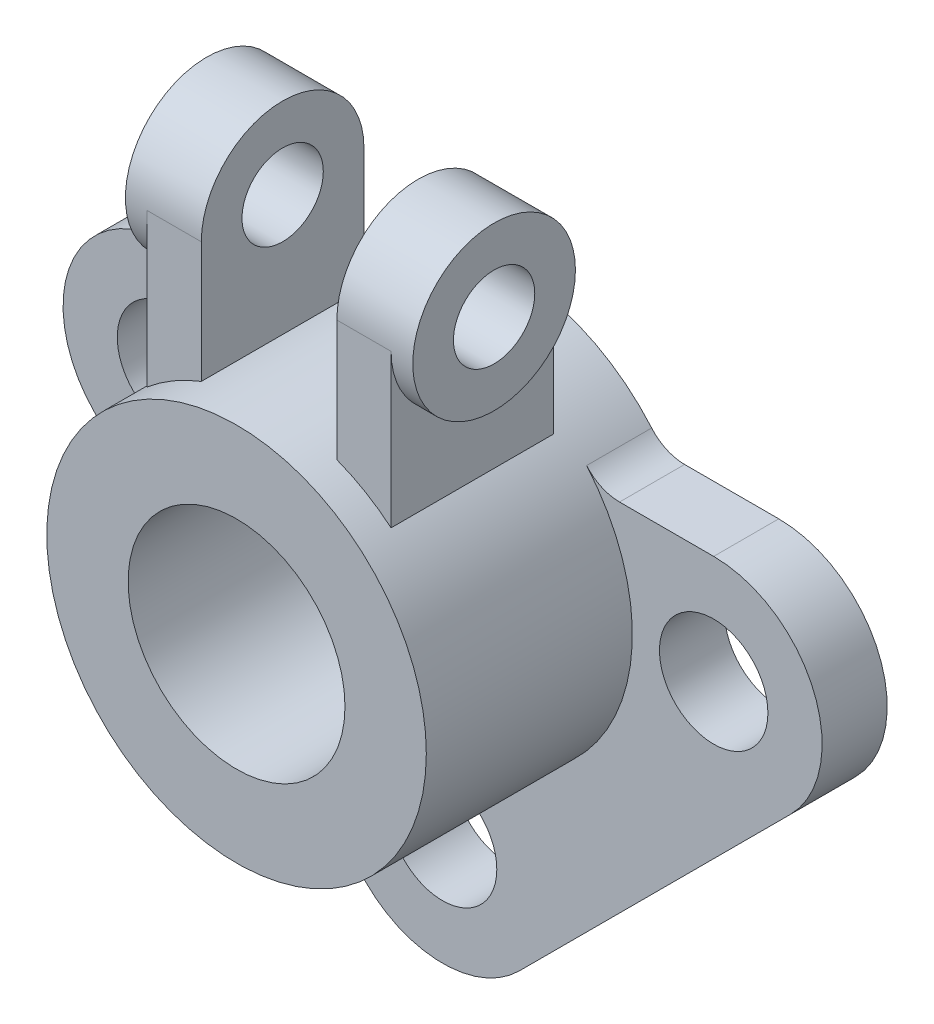
ISO-10303-21;
HEADER;
FILE_DESCRIPTION(('STEP AP214'),'2;1');
FILE_NAME('part.step','',(''),(''),'','','');
FILE_SCHEMA(('AUTOMOTIVE_DESIGN { 1 0 10303 214 1 1 1 1 }'));
ENDSEC;
DATA;
#1=APPLICATION_CONTEXT('core data for automotive mechanical design processes');
#2=APPLICATION_PROTOCOL_DEFINITION('international standard','automotive_design',2000,#1);
#3=PRODUCT_CONTEXT('',#1,'mechanical');
#4=PRODUCT('Part','Part','',(#3));
#5=PRODUCT_RELATED_PRODUCT_CATEGORY('part','',(#4));
#6=PRODUCT_DEFINITION_FORMATION('','',#4);
#7=PRODUCT_DEFINITION_CONTEXT('part definition',#1,'design');
#8=PRODUCT_DEFINITION('design','',#6,#7);
#9=PRODUCT_DEFINITION_SHAPE('','',#8);
#10=(LENGTH_UNIT() NAMED_UNIT(*) SI_UNIT(.MILLI.,.METRE.));
#11=(NAMED_UNIT(*) PLANE_ANGLE_UNIT() SI_UNIT($,.RADIAN.));
#12=(NAMED_UNIT(*) SI_UNIT($,.STERADIAN.) SOLID_ANGLE_UNIT());
#13=UNCERTAINTY_MEASURE_WITH_UNIT(LENGTH_MEASURE(1.E-05),#10,'distance_accuracy_value','');
#14=(GEOMETRIC_REPRESENTATION_CONTEXT(3) GLOBAL_UNCERTAINTY_ASSIGNED_CONTEXT((#13)) GLOBAL_UNIT_ASSIGNED_CONTEXT((#10,
#11,#12)) REPRESENTATION_CONTEXT('',''));
#15=CARTESIAN_POINT('',(0.,0.,0.));
#16=DIRECTION('',(0.,0.,1.));
#17=DIRECTION('',(1.,0.,0.));
#18=AXIS2_PLACEMENT_3D('',#15,#16,#17);
#19=CARTESIAN_POINT('',(0.,0.,50.));
#20=DIRECTION('',(0.,0.,-1.));
#21=DIRECTION('',(-1.,0.,0.));
#22=AXIS2_PLACEMENT_3D('',#19,#20,#21);
#23=CYLINDRICAL_SURFACE('',#22,35.);
#24=CARTESIAN_POINT('',(0.,0.,50.));
#25=DIRECTION('',(0.,0.,1.));
#26=DIRECTION('',(1.,0.,0.));
#27=AXIS2_PLACEMENT_3D('',#24,#25,#26);
#28=CIRCLE('',#27,35.);
#29=CARTESIAN_POINT('',(35.,0.,50.));
#30=VERTEX_POINT('',#29);
#31=EDGE_CURVE('E250',#30,#30,#28,.T.);
#32=ORIENTED_EDGE('',*,*,#31,.F.);
#33=EDGE_LOOP('',(#32));
#34=FACE_BOUND('',#33,.T.);
#35=CARTESIAN_POINT('',(0.,0.,0.));
#36=DIRECTION('',(0.,0.,1.));
#37=DIRECTION('',(1.,0.,0.));
#38=AXIS2_PLACEMENT_3D('',#35,#36,#37);
#39=CIRCLE('',#38,35.);
#40=CARTESIAN_POINT('',(26.5628330475733,22.7906976744186,0.));
#41=VERTEX_POINT('',#40);
#42=CARTESIAN_POINT('',(-26.5628330475733,22.7906976744186,0.));
#43=VERTEX_POINT('',#42);
#44=EDGE_CURVE('E249',#41,#43,#39,.T.);
#45=ORIENTED_EDGE('',*,*,#44,.T.);
#46=DIRECTION('',(0.,0.,-1.));
#47=VECTOR('',#46,1.);
#48=CARTESIAN_POINT('',(-26.5628330475733,22.7906976744186,50.));
#49=LINE('',#48,#47);
#50=CARTESIAN_POINT('',(-26.5628330475733,22.7906976744186,12.));
#51=VERTEX_POINT('',#50);
#52=EDGE_CURVE('E368',#43,#51,#49,.F.);
#53=ORIENTED_EDGE('',*,*,#52,.T.);
#54=CARTESIAN_POINT('',(0.,0.,12.));
#55=DIRECTION('',(0.,0.,1.));
#56=DIRECTION('',(1.,0.,0.));
#57=AXIS2_PLACEMENT_3D('',#54,#55,#56);
#58=CIRCLE('',#57,35.);
#59=CARTESIAN_POINT('',(26.5628330475733,22.7906976744186,12.));
#60=VERTEX_POINT('',#59);
#61=EDGE_CURVE('E266',#51,#60,#58,.T.);
#62=ORIENTED_EDGE('',*,*,#61,.T.);
#63=DIRECTION('',(0.,0.,-1.));
#64=VECTOR('',#63,1.);
#65=CARTESIAN_POINT('',(26.5628330475733,22.7906976744186,50.));
#66=LINE('',#65,#64);
#67=EDGE_CURVE('E364',#60,#41,#66,.T.);
#68=ORIENTED_EDGE('',*,*,#67,.T.);
#69=EDGE_LOOP('',(#45,#53,#62,#68));
#70=FACE_BOUND('',#69,.T.);
#71=CARTESIAN_POINT('',(0.,0.,14.));
#72=DIRECTION('',(0.,0.,1.));
#73=DIRECTION('',(1.,0.,0.));
#74=AXIS2_PLACEMENT_3D('',#71,#72,#73);
#75=CIRCLE('',#74,35.);
#76=CARTESIAN_POINT('',(22.5,26.809513236909,14.));
#77=VERTEX_POINT('',#76);
#78=CARTESIAN_POINT('',(12.5,32.6917420765551,14.));
#79=VERTEX_POINT('',#78);
#80=EDGE_CURVE('E392',#77,#79,#75,.T.);
#81=ORIENTED_EDGE('',*,*,#80,.F.);
#82=DIRECTION('',(0.,0.,-1.));
#83=VECTOR('',#82,1.);
#84=CARTESIAN_POINT('',(22.5,26.809513236909,50.));
#85=LINE('',#84,#83);
#86=CARTESIAN_POINT('',(22.5,26.809513236909,44.));
#87=VERTEX_POINT('',#86);
#88=EDGE_CURVE('E11',#77,#87,#85,.F.);
#89=ORIENTED_EDGE('',*,*,#88,.T.);
#90=CARTESIAN_POINT('',(0.,0.,44.));
#91=DIRECTION('',(0.,0.,-1.));
#92=DIRECTION('',(-1.,0.,0.));
#93=AXIS2_PLACEMENT_3D('',#90,#91,#92);
#94=CIRCLE('',#93,35.);
#95=CARTESIAN_POINT('',(12.5,32.6917420765551,44.));
#96=VERTEX_POINT('',#95);
#97=EDGE_CURVE('E47',#96,#87,#94,.T.);
#98=ORIENTED_EDGE('',*,*,#97,.F.);
#99=DIRECTION('',(0.,0.,-1.));
#100=VECTOR('',#99,1.);
#101=CARTESIAN_POINT('',(12.5,32.6917420765551,50.));
#102=LINE('',#101,#100);
#103=EDGE_CURVE('E388',#79,#96,#102,.F.);
#104=ORIENTED_EDGE('',*,*,#103,.F.);
#105=EDGE_LOOP('',(#81,#89,#98,#104));
#106=FACE_BOUND('',#105,.T.);
#107=CARTESIAN_POINT('',(0.,0.,44.));
#108=DIRECTION('',(0.,0.,1.));
#109=DIRECTION('',(1.,0.,0.));
#110=AXIS2_PLACEMENT_3D('',#107,#108,#109);
#111=CIRCLE('',#110,35.);
#112=CARTESIAN_POINT('',(-12.5,32.6917420765551,44.));
#113=VERTEX_POINT('',#112);
#114=CARTESIAN_POINT('',(-22.5,26.809513236909,44.));
#115=VERTEX_POINT('',#114);
#116=EDGE_CURVE('E54',#113,#115,#111,.T.);
#117=ORIENTED_EDGE('',*,*,#116,.T.);
#118=DIRECTION('',(0.,0.,-1.));
#119=VECTOR('',#118,1.);
#120=CARTESIAN_POINT('',(-22.5,26.809513236909,50.));
#121=LINE('',#120,#119);
#122=CARTESIAN_POINT('',(-22.5,26.809513236909,14.));
#123=VERTEX_POINT('',#122);
#124=EDGE_CURVE('E204',#123,#115,#121,.F.);
#125=ORIENTED_EDGE('',*,*,#124,.F.);
#126=CARTESIAN_POINT('',(0.,0.,14.));
#127=DIRECTION('',(0.,0.,-1.));
#128=DIRECTION('',(-1.,0.,0.));
#129=AXIS2_PLACEMENT_3D('',#126,#127,#128);
#130=CIRCLE('',#129,35.);
#131=CARTESIAN_POINT('',(-12.5,32.6917420765551,14.));
#132=VERTEX_POINT('',#131);
#133=EDGE_CURVE('E199',#123,#132,#130,.T.);
#134=ORIENTED_EDGE('',*,*,#133,.T.);
#135=DIRECTION('',(0.,0.,-1.));
#136=VECTOR('',#135,1.);
#137=CARTESIAN_POINT('',(-12.5,32.6917420765551,50.));
#138=LINE('',#137,#136);
#139=EDGE_CURVE('E59',#132,#113,#138,.F.);
#140=ORIENTED_EDGE('',*,*,#139,.T.);
#141=EDGE_LOOP('',(#117,#125,#134,#140));
#142=FACE_BOUND('',#141,.T.);
#143=ADVANCED_FACE('F38',(#34,#70,#106,#142),#23,.T.);
#144=CARTESIAN_POINT('',(0.,20.,12.));
#145=DIRECTION('',(0.,1.,0.));
#146=DIRECTION('',(-1.,0.,0.));
#147=AXIS2_PLACEMENT_3D('',#144,#145,#146);
#148=PLANE('',#147);
#149=DIRECTION('',(1.,0.,0.));
#150=VECTOR('',#149,1.);
#151=CARTESIAN_POINT('',(0.,20.,12.));
#152=LINE('',#151,#150);
#153=CARTESIAN_POINT('',(-50.,20.,12.));
#154=VERTEX_POINT('',#153);
#155=CARTESIAN_POINT('',(-32.6343377441615,20.,12.));
#156=VERTEX_POINT('',#155);
#157=EDGE_CURVE('E269',#154,#156,#152,.T.);
#158=ORIENTED_EDGE('',*,*,#157,.T.);
#159=DIRECTION('',(0.,0.,-1.));
#160=VECTOR('',#159,1.);
#161=CARTESIAN_POINT('',(-32.6343377441615,20.,12.));
#162=LINE('',#161,#160);
#163=CARTESIAN_POINT('',(-32.6343377441615,20.,0.));
#164=VERTEX_POINT('',#163);
#165=EDGE_CURVE('E360',#156,#164,#162,.T.);
#166=ORIENTED_EDGE('',*,*,#165,.T.);
#167=DIRECTION('',(1.,0.,0.));
#168=VECTOR('',#167,1.);
#169=CARTESIAN_POINT('',(0.,20.,0.));
#170=LINE('',#169,#168);
#171=CARTESIAN_POINT('',(-50.,20.,0.));
#172=VERTEX_POINT('',#171);
#173=EDGE_CURVE('E259',#172,#164,#170,.T.);
#174=ORIENTED_EDGE('',*,*,#173,.F.);
#175=DIRECTION('',(0.,0.,-1.));
#176=VECTOR('',#175,1.);
#177=CARTESIAN_POINT('',(-50.,20.,12.));
#178=LINE('',#177,#176);
#179=EDGE_CURVE('E357',#154,#172,#178,.T.);
#180=ORIENTED_EDGE('',*,*,#179,.F.);
#181=EDGE_LOOP('',(#158,#166,#174,#180));
#182=FACE_BOUND('',#181,.T.);
#183=ADVANCED_FACE('F428',(#182),#148,.T.);
#184=CARTESIAN_POINT('',(-50.,0.,12.));
#185=DIRECTION('',(0.,0.,-1.));
#186=DIRECTION('',(-1.,0.,0.));
#187=AXIS2_PLACEMENT_3D('',#184,#185,#186);
#188=CYLINDRICAL_SURFACE('',#187,20.);
#189=CARTESIAN_POINT('',(-50.,0.,0.));
#190=DIRECTION('',(0.,0.,1.));
#191=DIRECTION('',(1.,0.,0.));
#192=AXIS2_PLACEMENT_3D('',#189,#190,#191);
#193=CIRCLE('',#192,20.);
#194=CARTESIAN_POINT('',(-64.142135623731,-14.142135623731,0.));
#195=VERTEX_POINT('',#194);
#196=EDGE_CURVE('E310',#172,#195,#193,.T.);
#197=ORIENTED_EDGE('',*,*,#196,.T.);
#198=DIRECTION('',(0.,0.,-1.));
#199=VECTOR('',#198,1.);
#200=CARTESIAN_POINT('',(-64.142135623731,-14.142135623731,12.));
#201=LINE('',#200,#199);
#202=CARTESIAN_POINT('',(-64.142135623731,-14.142135623731,12.));
#203=VERTEX_POINT('',#202);
#204=EDGE_CURVE('E354',#203,#195,#201,.T.);
#205=ORIENTED_EDGE('',*,*,#204,.F.);
#206=CARTESIAN_POINT('',(-50.,0.,12.));
#207=DIRECTION('',(0.,0.,1.));
#208=DIRECTION('',(1.,0.,0.));
#209=AXIS2_PLACEMENT_3D('',#206,#207,#208);
#210=CIRCLE('',#209,20.);
#211=EDGE_CURVE('E274',#154,#203,#210,.T.);
#212=ORIENTED_EDGE('',*,*,#211,.F.);
#213=ORIENTED_EDGE('',*,*,#179,.T.);
#214=EDGE_LOOP('',(#197,#205,#212,#213));
#215=FACE_BOUND('',#214,.T.);
#216=ADVANCED_FACE('F434',(#215),#188,.T.);
#217=CARTESIAN_POINT('',(-39.142135623731,-39.142135623731,12.));
#218=DIRECTION('',(-0.707106781186547,-0.707106781186548,0.));
#219=DIRECTION('',(0.707106781186548,-0.707106781186547,0.));
#220=AXIS2_PLACEMENT_3D('',#217,#218,#219);
#221=PLANE('',#220);
#222=DIRECTION('',(-0.707106781186548,0.707106781186547,0.));
#223=VECTOR('',#222,1.);
#224=CARTESIAN_POINT('',(-39.142135623731,-39.142135623731,0.));
#225=LINE('',#224,#223);
#226=CARTESIAN_POINT('',(-14.142135623731,-64.142135623731,0.));
#227=VERTEX_POINT('',#226);
#228=EDGE_CURVE('E315',#227,#195,#225,.T.);
#229=ORIENTED_EDGE('',*,*,#228,.F.);
#230=DIRECTION('',(0.,0.,-1.));
#231=VECTOR('',#230,1.);
#232=CARTESIAN_POINT('',(-14.142135623731,-64.142135623731,12.));
#233=LINE('',#232,#231);
#234=CARTESIAN_POINT('',(-14.142135623731,-64.142135623731,12.));
#235=VERTEX_POINT('',#234);
#236=EDGE_CURVE('E351',#235,#227,#233,.T.);
#237=ORIENTED_EDGE('',*,*,#236,.F.);
#238=DIRECTION('',(-0.707106781186548,0.707106781186547,0.));
#239=VECTOR('',#238,1.);
#240=CARTESIAN_POINT('',(-39.142135623731,-39.142135623731,12.));
#241=LINE('',#240,#239);
#242=EDGE_CURVE('E278',#235,#203,#241,.T.);
#243=ORIENTED_EDGE('',*,*,#242,.T.);
#244=ORIENTED_EDGE('',*,*,#204,.T.);
#245=EDGE_LOOP('',(#229,#237,#243,#244));
#246=FACE_BOUND('',#245,.T.);
#247=ADVANCED_FACE('F477',(#246),#221,.T.);
#248=CARTESIAN_POINT('',(0.,-50.,12.));
#249=DIRECTION('',(0.,0.,-1.));
#250=DIRECTION('',(-1.,0.,0.));
#251=AXIS2_PLACEMENT_3D('',#248,#249,#250);
#252=CYLINDRICAL_SURFACE('',#251,20.);
#253=CARTESIAN_POINT('',(0.,-50.,0.));
#254=DIRECTION('',(0.,0.,1.));
#255=DIRECTION('',(1.,0.,0.));
#256=AXIS2_PLACEMENT_3D('',#253,#254,#255);
#257=CIRCLE('',#256,20.);
#258=CARTESIAN_POINT('',(14.142135623731,-64.1421356237309,0.));
#259=VERTEX_POINT('',#258);
#260=EDGE_CURVE('E319',#259,#227,#257,.F.);
#261=ORIENTED_EDGE('',*,*,#260,.F.);
#262=DIRECTION('',(0.,0.,-1.));
#263=VECTOR('',#262,1.);
#264=CARTESIAN_POINT('',(14.142135623731,-64.1421356237309,12.));
#265=LINE('',#264,#263);
#266=CARTESIAN_POINT('',(14.142135623731,-64.1421356237309,12.));
#267=VERTEX_POINT('',#266);
#268=EDGE_CURVE('E348',#267,#259,#265,.T.);
#269=ORIENTED_EDGE('',*,*,#268,.F.);
#270=CARTESIAN_POINT('',(0.,-50.,12.));
#271=DIRECTION('',(0.,0.,1.));
#272=DIRECTION('',(1.,0.,0.));
#273=AXIS2_PLACEMENT_3D('',#270,#271,#272);
#274=CIRCLE('',#273,20.);
#275=EDGE_CURVE('E282',#267,#235,#274,.F.);
#276=ORIENTED_EDGE('',*,*,#275,.T.);
#277=ORIENTED_EDGE('',*,*,#236,.T.);
#278=EDGE_LOOP('',(#261,#269,#276,#277));
#279=FACE_BOUND('',#278,.T.);
#280=ADVANCED_FACE('F473',(#279),#252,.T.);
#281=CARTESIAN_POINT('',(39.1421356237309,-39.1421356237309,12.));
#282=DIRECTION('',(0.707106781186547,-0.707106781186547,0.));
#283=DIRECTION('',(0.707106781186548,0.707106781186548,0.));
#284=AXIS2_PLACEMENT_3D('',#281,#282,#283);
#285=PLANE('',#284);
#286=DIRECTION('',(-0.707106781186548,-0.707106781186548,0.));
#287=VECTOR('',#286,1.);
#288=CARTESIAN_POINT('',(39.1421356237309,-39.1421356237309,0.));
#289=LINE('',#288,#287);
#290=CARTESIAN_POINT('',(64.142135623731,-14.1421356237309,0.));
#291=VERTEX_POINT('',#290);
#292=EDGE_CURVE('E323',#291,#259,#289,.T.);
#293=ORIENTED_EDGE('',*,*,#292,.F.);
#294=DIRECTION('',(0.,0.,-1.));
#295=VECTOR('',#294,1.);
#296=CARTESIAN_POINT('',(64.142135623731,-14.1421356237309,12.));
#297=LINE('',#296,#295);
#298=CARTESIAN_POINT('',(64.142135623731,-14.1421356237309,12.));
#299=VERTEX_POINT('',#298);
#300=EDGE_CURVE('E345',#299,#291,#297,.T.);
#301=ORIENTED_EDGE('',*,*,#300,.F.);
#302=DIRECTION('',(-0.707106781186548,-0.707106781186548,0.));
#303=VECTOR('',#302,1.);
#304=CARTESIAN_POINT('',(39.1421356237309,-39.1421356237309,12.));
#305=LINE('',#304,#303);
#306=EDGE_CURVE('E286',#299,#267,#305,.T.);
#307=ORIENTED_EDGE('',*,*,#306,.T.);
#308=ORIENTED_EDGE('',*,*,#268,.T.);
#309=EDGE_LOOP('',(#293,#301,#307,#308));
#310=FACE_BOUND('',#309,.T.);
#311=ADVANCED_FACE('F469',(#310),#285,.T.);
#312=CARTESIAN_POINT('',(50.,0.,12.));
#313=DIRECTION('',(0.,0.,-1.));
#314=DIRECTION('',(-1.,0.,0.));
#315=AXIS2_PLACEMENT_3D('',#312,#313,#314);
#316=CYLINDRICAL_SURFACE('',#315,20.);
#317=CARTESIAN_POINT('',(50.,0.,0.));
#318=DIRECTION('',(0.,0.,1.));
#319=DIRECTION('',(1.,0.,0.));
#320=AXIS2_PLACEMENT_3D('',#317,#318,#319);
#321=CIRCLE('',#320,20.);
#322=CARTESIAN_POINT('',(50.,20.,0.));
#323=VERTEX_POINT('',#322);
#324=EDGE_CURVE('E327',#323,#291,#321,.F.);
#325=ORIENTED_EDGE('',*,*,#324,.F.);
#326=DIRECTION('',(0.,0.,-1.));
#327=VECTOR('',#326,1.);
#328=CARTESIAN_POINT('',(50.,20.,12.));
#329=LINE('',#328,#327);
#330=CARTESIAN_POINT('',(50.,20.,12.));
#331=VERTEX_POINT('',#330);
#332=EDGE_CURVE('E306',#331,#323,#329,.T.);
#333=ORIENTED_EDGE('',*,*,#332,.F.);
#334=CARTESIAN_POINT('',(50.,0.,12.));
#335=DIRECTION('',(0.,0.,1.));
#336=DIRECTION('',(1.,0.,0.));
#337=AXIS2_PLACEMENT_3D('',#334,#335,#336);
#338=CIRCLE('',#337,20.);
#339=EDGE_CURVE('E290',#331,#299,#338,.F.);
#340=ORIENTED_EDGE('',*,*,#339,.T.);
#341=ORIENTED_EDGE('',*,*,#300,.T.);
#342=EDGE_LOOP('',(#325,#333,#340,#341));
#343=FACE_BOUND('',#342,.T.);
#344=ADVANCED_FACE('F460',(#343),#316,.T.);
#345=CARTESIAN_POINT('',(-50.,0.,12.));
#346=DIRECTION('',(0.,0.,-1.));
#347=DIRECTION('',(-1.,0.,0.));
#348=AXIS2_PLACEMENT_3D('',#345,#346,#347);
#349=CYLINDRICAL_SURFACE('',#348,10.);
#350=CARTESIAN_POINT('',(-50.,0.,12.));
#351=DIRECTION('',(0.,0.,1.));
#352=DIRECTION('',(1.,0.,0.));
#353=AXIS2_PLACEMENT_3D('',#350,#351,#352);
#354=CIRCLE('',#353,10.);
#355=CARTESIAN_POINT('',(-40.,0.,12.));
#356=VERTEX_POINT('',#355);
#357=EDGE_CURVE('E298',#356,#356,#354,.T.);
#358=ORIENTED_EDGE('',*,*,#357,.T.);
#359=EDGE_LOOP('',(#358));
#360=FACE_BOUND('',#359,.T.);
#361=CARTESIAN_POINT('',(-50.,0.,0.));
#362=DIRECTION('',(0.,0.,1.));
#363=DIRECTION('',(1.,0.,0.));
#364=AXIS2_PLACEMENT_3D('',#361,#362,#363);
#365=CIRCLE('',#364,10.);
#366=CARTESIAN_POINT('',(-40.,0.,0.));
#367=VERTEX_POINT('',#366);
#368=EDGE_CURVE('E335',#367,#367,#365,.T.);
#369=ORIENTED_EDGE('',*,*,#368,.F.);
#370=EDGE_LOOP('',(#369));
#371=FACE_BOUND('',#370,.T.);
#372=ADVANCED_FACE('F456',(#360,#371),#349,.F.);
#373=CARTESIAN_POINT('',(50.,0.,12.));
#374=DIRECTION('',(0.,0.,-1.));
#375=DIRECTION('',(-1.,0.,0.));
#376=AXIS2_PLACEMENT_3D('',#373,#374,#375);
#377=CYLINDRICAL_SURFACE('',#376,10.);
#378=CARTESIAN_POINT('',(50.,0.,12.));
#379=DIRECTION('',(0.,0.,1.));
#380=DIRECTION('',(1.,0.,0.));
#381=AXIS2_PLACEMENT_3D('',#378,#379,#380);
#382=CIRCLE('',#381,10.);
#383=CARTESIAN_POINT('',(60.,0.,12.));
#384=VERTEX_POINT('',#383);
#385=EDGE_CURVE('E294',#384,#384,#382,.T.);
#386=ORIENTED_EDGE('',*,*,#385,.T.);
#387=EDGE_LOOP('',(#386));
#388=FACE_BOUND('',#387,.T.);
#389=CARTESIAN_POINT('',(50.,0.,0.));
#390=DIRECTION('',(0.,0.,1.));
#391=DIRECTION('',(1.,0.,0.));
#392=AXIS2_PLACEMENT_3D('',#389,#390,#391);
#393=CIRCLE('',#392,10.);
#394=CARTESIAN_POINT('',(60.,0.,0.));
#395=VERTEX_POINT('',#394);
#396=EDGE_CURVE('E331',#395,#395,#393,.T.);
#397=ORIENTED_EDGE('',*,*,#396,.F.);
#398=EDGE_LOOP('',(#397));
#399=FACE_BOUND('',#398,.T.);
#400=ADVANCED_FACE('F459',(#388,#399),#377,.F.);
#401=CARTESIAN_POINT('',(32.6343377441614,20.,0.));
#402=VERTEX_POINT('',#401);
#403=EDGE_CURVE('E311',#402,#323,#170,.T.);
#404=ORIENTED_EDGE('',*,*,#403,.F.);
#405=DIRECTION('',(0.,0.,-1.));
#406=VECTOR('',#405,1.);
#407=CARTESIAN_POINT('',(32.6343377441614,20.,12.));
#408=LINE('',#407,#406);
#409=CARTESIAN_POINT('',(32.6343377441614,20.,12.));
#410=VERTEX_POINT('',#409);
#411=EDGE_CURVE('E372',#402,#410,#408,.F.);
#412=ORIENTED_EDGE('',*,*,#411,.T.);
#413=EDGE_CURVE('E275',#410,#331,#152,.T.);
#414=ORIENTED_EDGE('',*,*,#413,.T.);
#415=ORIENTED_EDGE('',*,*,#332,.T.);
#416=EDGE_LOOP('',(#404,#412,#414,#415));
#417=FACE_BOUND('',#416,.T.);
#418=ADVANCED_FACE('F437',(#417),#148,.T.);
#419=CARTESIAN_POINT('',(0.,-50.,12.));
#420=DIRECTION('',(0.,0.,-1.));
#421=DIRECTION('',(-1.,0.,0.));
#422=AXIS2_PLACEMENT_3D('',#419,#420,#421);
#423=CYLINDRICAL_SURFACE('',#422,10.);
#424=CARTESIAN_POINT('',(0.,-50.,12.));
#425=DIRECTION('',(0.,0.,1.));
#426=DIRECTION('',(1.,0.,0.));
#427=AXIS2_PLACEMENT_3D('',#424,#425,#426);
#428=CIRCLE('',#427,10.);
#429=CARTESIAN_POINT('',(10.,-50.,12.));
#430=VERTEX_POINT('',#429);
#431=EDGE_CURVE('E302',#430,#430,#428,.T.);
#432=ORIENTED_EDGE('',*,*,#431,.T.);
#433=EDGE_LOOP('',(#432));
#434=FACE_BOUND('',#433,.T.);
#435=CARTESIAN_POINT('',(0.,-50.,0.));
#436=DIRECTION('',(0.,0.,1.));
#437=DIRECTION('',(1.,0.,0.));
#438=AXIS2_PLACEMENT_3D('',#435,#436,#437);
#439=CIRCLE('',#438,10.);
#440=CARTESIAN_POINT('',(10.,-50.,0.));
#441=VERTEX_POINT('',#440);
#442=EDGE_CURVE('E270',#441,#441,#439,.T.);
#443=ORIENTED_EDGE('',*,*,#442,.F.);
#444=EDGE_LOOP('',(#443));
#445=FACE_BOUND('',#444,.T.);
#446=ADVANCED_FACE('F448',(#434,#445),#423,.F.);
#447=CARTESIAN_POINT('',(0.,0.,12.));
#448=DIRECTION('',(0.,0.,1.));
#449=DIRECTION('',(1.,0.,0.));
#450=AXIS2_PLACEMENT_3D('',#447,#448,#449);
#451=PLANE('',#450);
#452=ORIENTED_EDGE('',*,*,#61,.F.);
#453=CARTESIAN_POINT('',(-32.6343377441615,28.,12.));
#454=DIRECTION('',(0.,0.,1.));
#455=DIRECTION('',(1.,0.,0.));
#456=AXIS2_PLACEMENT_3D('',#453,#454,#455);
#457=CIRCLE('',#456,8.);
#458=EDGE_CURVE('E378',#51,#156,#457,.F.);
#459=ORIENTED_EDGE('',*,*,#458,.T.);
#460=ORIENTED_EDGE('',*,*,#157,.F.);
#461=ORIENTED_EDGE('',*,*,#211,.T.);
#462=ORIENTED_EDGE('',*,*,#242,.F.);
#463=ORIENTED_EDGE('',*,*,#275,.F.);
#464=ORIENTED_EDGE('',*,*,#306,.F.);
#465=ORIENTED_EDGE('',*,*,#339,.F.);
#466=ORIENTED_EDGE('',*,*,#413,.F.);
#467=CARTESIAN_POINT('',(32.6343377441614,28.,12.));
#468=DIRECTION('',(0.,0.,1.));
#469=DIRECTION('',(1.,0.,0.));
#470=AXIS2_PLACEMENT_3D('',#467,#468,#469);
#471=CIRCLE('',#470,8.);
#472=EDGE_CURVE('E384',#410,#60,#471,.F.);
#473=ORIENTED_EDGE('',*,*,#472,.T.);
#474=EDGE_LOOP('',(#452,#459,#460,#461,#462,#463,#464,#465,#466,#473));
#475=FACE_BOUND('',#474,.T.);
#476=ORIENTED_EDGE('',*,*,#385,.F.);
#477=EDGE_LOOP('',(#476));
#478=FACE_BOUND('',#477,.T.);
#479=ORIENTED_EDGE('',*,*,#357,.F.);
#480=EDGE_LOOP('',(#479));
#481=FACE_BOUND('',#480,.T.);
#482=ORIENTED_EDGE('',*,*,#431,.F.);
#483=EDGE_LOOP('',(#482));
#484=FACE_BOUND('',#483,.T.);
#485=ADVANCED_FACE('F444',(#475,#478,#481,#484),#451,.T.);
#486=CARTESIAN_POINT('',(0.,0.,0.));
#487=DIRECTION('',(0.,0.,1.));
#488=DIRECTION('',(1.,0.,0.));
#489=AXIS2_PLACEMENT_3D('',#486,#487,#488);
#490=PLANE('',#489);
#491=ORIENTED_EDGE('',*,*,#173,.T.);
#492=CARTESIAN_POINT('',(-32.6343377441615,28.,0.));
#493=DIRECTION('',(0.,0.,1.));
#494=DIRECTION('',(1.,0.,0.));
#495=AXIS2_PLACEMENT_3D('',#492,#493,#494);
#496=CIRCLE('',#495,8.);
#497=EDGE_CURVE('E375',#164,#43,#496,.T.);
#498=ORIENTED_EDGE('',*,*,#497,.T.);
#499=ORIENTED_EDGE('',*,*,#44,.F.);
#500=CARTESIAN_POINT('',(32.6343377441614,28.,0.));
#501=DIRECTION('',(0.,0.,1.));
#502=DIRECTION('',(1.,0.,0.));
#503=AXIS2_PLACEMENT_3D('',#500,#501,#502);
#504=CIRCLE('',#503,8.);
#505=EDGE_CURVE('E381',#41,#402,#504,.T.);
#506=ORIENTED_EDGE('',*,*,#505,.T.);
#507=ORIENTED_EDGE('',*,*,#403,.T.);
#508=ORIENTED_EDGE('',*,*,#324,.T.);
#509=ORIENTED_EDGE('',*,*,#292,.T.);
#510=ORIENTED_EDGE('',*,*,#260,.T.);
#511=ORIENTED_EDGE('',*,*,#228,.T.);
#512=ORIENTED_EDGE('',*,*,#196,.F.);
#513=EDGE_LOOP('',(#491,#498,#499,#506,#507,#508,#509,#510,#511,#512));
#514=FACE_BOUND('',#513,.T.);
#515=ORIENTED_EDGE('',*,*,#396,.T.);
#516=EDGE_LOOP('',(#515));
#517=FACE_BOUND('',#516,.T.);
#518=ORIENTED_EDGE('',*,*,#368,.T.);
#519=EDGE_LOOP('',(#518));
#520=FACE_BOUND('',#519,.T.);
#521=ORIENTED_EDGE('',*,*,#442,.T.);
#522=EDGE_LOOP('',(#521));
#523=FACE_BOUND('',#522,.T.);
#524=CARTESIAN_POINT('',(0.,0.,0.));
#525=DIRECTION('',(0.,0.,1.));
#526=DIRECTION('',(1.,0.,0.));
#527=AXIS2_PLACEMENT_3D('',#524,#525,#526);
#528=CIRCLE('',#527,20.);
#529=CARTESIAN_POINT('',(20.,0.,0.));
#530=VERTEX_POINT('',#529);
#531=EDGE_CURVE('E255',#530,#530,#528,.T.);
#532=ORIENTED_EDGE('',*,*,#531,.T.);
#533=EDGE_LOOP('',(#532));
#534=FACE_BOUND('',#533,.T.);
#535=ADVANCED_FACE('F447',(#514,#517,#520,#523,#534),#490,.F.);
#536=CARTESIAN_POINT('',(0.,0.,50.));
#537=DIRECTION('',(0.,0.,-1.));
#538=DIRECTION('',(-1.,0.,0.));
#539=AXIS2_PLACEMENT_3D('',#536,#537,#538);
#540=CYLINDRICAL_SURFACE('',#539,20.);
#541=CARTESIAN_POINT('',(0.,0.,50.));
#542=DIRECTION('',(0.,0.,1.));
#543=DIRECTION('',(1.,0.,0.));
#544=AXIS2_PLACEMENT_3D('',#541,#542,#543);
#545=CIRCLE('',#544,20.);
#546=CARTESIAN_POINT('',(20.,0.,50.));
#547=VERTEX_POINT('',#546);
#548=EDGE_CURVE('E254',#547,#547,#545,.T.);
#549=ORIENTED_EDGE('',*,*,#548,.T.);
#550=EDGE_LOOP('',(#549));
#551=FACE_BOUND('',#550,.T.);
#552=ORIENTED_EDGE('',*,*,#531,.F.);
#553=EDGE_LOOP('',(#552));
#554=FACE_BOUND('',#553,.T.);
#555=ADVANCED_FACE('F442',(#551,#554),#540,.F.);
#556=CARTESIAN_POINT('',(0.,0.,50.));
#557=DIRECTION('',(0.,0.,1.));
#558=DIRECTION('',(1.,0.,0.));
#559=AXIS2_PLACEMENT_3D('',#556,#557,#558);
#560=PLANE('',#559);
#561=ORIENTED_EDGE('',*,*,#31,.T.);
#562=EDGE_LOOP('',(#561));
#563=FACE_BOUND('',#562,.T.);
#564=ORIENTED_EDGE('',*,*,#548,.F.);
#565=EDGE_LOOP('',(#564));
#566=FACE_BOUND('',#565,.T.);
#567=ADVANCED_FACE('F486',(#563,#566),#560,.T.);
#568=CARTESIAN_POINT('',(-32.6343377441615,28.,50.));
#569=DIRECTION('',(0.,0.,-1.));
#570=DIRECTION('',(-1.,0.,0.));
#571=AXIS2_PLACEMENT_3D('',#568,#569,#570);
#572=CYLINDRICAL_SURFACE('',#571,8.);
#573=ORIENTED_EDGE('',*,*,#458,.F.);
#574=ORIENTED_EDGE('',*,*,#52,.F.);
#575=ORIENTED_EDGE('',*,*,#497,.F.);
#576=ORIENTED_EDGE('',*,*,#165,.F.);
#577=EDGE_LOOP('',(#573,#574,#575,#576));
#578=FACE_BOUND('',#577,.T.);
#579=ADVANCED_FACE('F484',(#578),#572,.F.);
#580=CARTESIAN_POINT('',(32.6343377441614,28.,50.));
#581=DIRECTION('',(0.,0.,-1.));
#582=DIRECTION('',(-1.,0.,0.));
#583=AXIS2_PLACEMENT_3D('',#580,#581,#582);
#584=CYLINDRICAL_SURFACE('',#583,8.);
#585=ORIENTED_EDGE('',*,*,#472,.F.);
#586=ORIENTED_EDGE('',*,*,#411,.F.);
#587=ORIENTED_EDGE('',*,*,#505,.F.);
#588=ORIENTED_EDGE('',*,*,#67,.F.);
#589=EDGE_LOOP('',(#585,#586,#587,#588));
#590=FACE_BOUND('',#589,.T.);
#591=ADVANCED_FACE('F40',(#590),#584,.F.);
#592=CARTESIAN_POINT('',(22.5,0.,0.));
#593=DIRECTION('',(1.,0.,0.));
#594=DIRECTION('',(0.,0.,-1.));
#595=AXIS2_PLACEMENT_3D('',#592,#593,#594);
#596=PLANE('',#595);
#597=CARTESIAN_POINT('',(22.5,55.,29.));
#598=DIRECTION('',(1.,0.,0.));
#599=DIRECTION('',(0.,0.,-1.));
#600=AXIS2_PLACEMENT_3D('',#597,#598,#599);
#601=CIRCLE('',#600,15.);
#602=CARTESIAN_POINT('',(22.5,55.,44.));
#603=VERTEX_POINT('',#602);
#604=CARTESIAN_POINT('',(22.5,55.,14.));
#605=VERTEX_POINT('',#604);
#606=EDGE_CURVE('E224',#603,#605,#601,.T.);
#607=ORIENTED_EDGE('',*,*,#606,.F.);
#608=DIRECTION('',(0.,-1.,0.));
#609=VECTOR('',#608,1.);
#610=CARTESIAN_POINT('',(22.5,55.,44.));
#611=LINE('',#610,#609);
#612=EDGE_CURVE('E229',#603,#87,#611,.T.);
#613=ORIENTED_EDGE('',*,*,#612,.T.);
#614=ORIENTED_EDGE('',*,*,#88,.F.);
#615=DIRECTION('',(0.,1.,0.));
#616=VECTOR('',#615,1.);
#617=CARTESIAN_POINT('',(22.5,20.9544012111653,14.));
#618=LINE('',#617,#616);
#619=EDGE_CURVE('E233',#77,#605,#618,.T.);
#620=ORIENTED_EDGE('',*,*,#619,.T.);
#621=EDGE_LOOP('',(#607,#613,#614,#620));
#622=FACE_BOUND('',#621,.T.);
#623=ADVANCED_FACE('F405',(#622),#596,.T.);
#624=CARTESIAN_POINT('',(12.5,0.,0.));
#625=DIRECTION('',(1.,0.,0.));
#626=DIRECTION('',(0.,0.,-1.));
#627=AXIS2_PLACEMENT_3D('',#624,#625,#626);
#628=PLANE('',#627);
#629=CARTESIAN_POINT('',(12.5,55.,29.));
#630=DIRECTION('',(1.,0.,0.));
#631=DIRECTION('',(0.,0.,-1.));
#632=AXIS2_PLACEMENT_3D('',#629,#630,#631);
#633=CIRCLE('',#632,7.5);
#634=CARTESIAN_POINT('',(12.5,55.,21.5));
#635=VERTEX_POINT('',#634);
#636=EDGE_CURVE('E212',#635,#635,#633,.F.);
#637=ORIENTED_EDGE('',*,*,#636,.F.);
#638=EDGE_LOOP('',(#637));
#639=FACE_BOUND('',#638,.T.);
#640=DIRECTION('',(0.,-1.,0.));
#641=VECTOR('',#640,1.);
#642=CARTESIAN_POINT('',(12.5,35.,44.));
#643=LINE('',#642,#641);
#644=CARTESIAN_POINT('',(12.5,55.,44.));
#645=VERTEX_POINT('',#644);
#646=EDGE_CURVE('E228',#645,#96,#643,.T.);
#647=ORIENTED_EDGE('',*,*,#646,.F.);
#648=CARTESIAN_POINT('',(12.5,55.,29.));
#649=DIRECTION('',(1.,0.,0.));
#650=DIRECTION('',(0.,0.,-1.));
#651=AXIS2_PLACEMENT_3D('',#648,#649,#650);
#652=CIRCLE('',#651,15.);
#653=CARTESIAN_POINT('',(12.5,55.,14.));
#654=VERTEX_POINT('',#653);
#655=EDGE_CURVE('E220',#654,#645,#652,.T.);
#656=ORIENTED_EDGE('',*,*,#655,.F.);
#657=DIRECTION('',(0.,1.,0.));
#658=VECTOR('',#657,1.);
#659=CARTESIAN_POINT('',(12.5,20.9544012111653,14.));
#660=LINE('',#659,#658);
#661=EDGE_CURVE('E234',#79,#654,#660,.T.);
#662=ORIENTED_EDGE('',*,*,#661,.F.);
#663=ORIENTED_EDGE('',*,*,#103,.T.);
#664=EDGE_LOOP('',(#647,#656,#662,#663));
#665=FACE_BOUND('',#664,.T.);
#666=ADVANCED_FACE('F412',(#639,#665),#628,.F.);
#667=CARTESIAN_POINT('',(22.5,35.,44.));
#668=DIRECTION('',(0.,0.,-1.));
#669=DIRECTION('',(-1.,0.,0.));
#670=AXIS2_PLACEMENT_3D('',#667,#668,#669);
#671=PLANE('',#670);
#672=ORIENTED_EDGE('',*,*,#646,.T.);
#673=ORIENTED_EDGE('',*,*,#97,.T.);
#674=ORIENTED_EDGE('',*,*,#612,.F.);
#675=DIRECTION('',(-1.,0.,0.));
#676=VECTOR('',#675,1.);
#677=CARTESIAN_POINT('',(22.5,55.,44.));
#678=LINE('',#677,#676);
#679=EDGE_CURVE('E237',#603,#645,#678,.T.);
#680=ORIENTED_EDGE('',*,*,#679,.T.);
#681=EDGE_LOOP('',(#672,#673,#674,#680));
#682=FACE_BOUND('',#681,.T.);
#683=ADVANCED_FACE('F399',(#682),#671,.F.);
#684=CARTESIAN_POINT('',(22.5,20.9544012111653,14.));
#685=DIRECTION('',(0.,0.,1.));
#686=DIRECTION('',(1.,0.,0.));
#687=AXIS2_PLACEMENT_3D('',#684,#685,#686);
#688=PLANE('',#687);
#689=ORIENTED_EDGE('',*,*,#619,.F.);
#690=ORIENTED_EDGE('',*,*,#80,.T.);
#691=ORIENTED_EDGE('',*,*,#661,.T.);
#692=DIRECTION('',(-1.,0.,0.));
#693=VECTOR('',#692,1.);
#694=CARTESIAN_POINT('',(22.5,55.,14.));
#695=LINE('',#694,#693);
#696=EDGE_CURVE('E245',#605,#654,#695,.T.);
#697=ORIENTED_EDGE('',*,*,#696,.F.);
#698=EDGE_LOOP('',(#689,#690,#691,#697));
#699=FACE_BOUND('',#698,.T.);
#700=ADVANCED_FACE('F415',(#699),#688,.F.);
#701=CARTESIAN_POINT('',(12.5,55.,29.));
#702=DIRECTION('',(1.,0.,0.));
#703=DIRECTION('',(0.,0.,-1.));
#704=AXIS2_PLACEMENT_3D('',#701,#702,#703);
#705=CYLINDRICAL_SURFACE('',#704,15.);
#706=CARTESIAN_POINT('',(26.5,55.,29.));
#707=DIRECTION('',(1.,0.,0.));
#708=DIRECTION('',(0.,0.,-1.));
#709=AXIS2_PLACEMENT_3D('',#706,#707,#708);
#710=CIRCLE('',#709,15.);
#711=CARTESIAN_POINT('',(26.5,55.,14.));
#712=VERTEX_POINT('',#711);
#713=EDGE_CURVE('E216',#712,#712,#710,.T.);
#714=ORIENTED_EDGE('',*,*,#713,.F.);
#715=EDGE_LOOP('',(#714));
#716=FACE_BOUND('',#715,.T.);
#717=ORIENTED_EDGE('',*,*,#696,.T.);
#718=ORIENTED_EDGE('',*,*,#655,.T.);
#719=ORIENTED_EDGE('',*,*,#679,.F.);
#720=ORIENTED_EDGE('',*,*,#606,.T.);
#721=EDGE_LOOP('',(#717,#718,#719,#720));
#722=FACE_BOUND('',#721,.T.);
#723=ADVANCED_FACE('F409',(#716,#722),#705,.T.);
#724=CARTESIAN_POINT('',(26.5,55.,29.));
#725=DIRECTION('',(1.,0.,0.));
#726=DIRECTION('',(0.,0.,-1.));
#727=AXIS2_PLACEMENT_3D('',#724,#725,#726);
#728=PLANE('',#727);
#729=CARTESIAN_POINT('',(26.5,55.,29.));
#730=DIRECTION('',(1.,0.,0.));
#731=DIRECTION('',(0.,0.,-1.));
#732=AXIS2_PLACEMENT_3D('',#729,#730,#731);
#733=CIRCLE('',#732,7.5);
#734=CARTESIAN_POINT('',(26.5,55.,21.5));
#735=VERTEX_POINT('',#734);
#736=EDGE_CURVE('E208',#735,#735,#733,.T.);
#737=ORIENTED_EDGE('',*,*,#736,.F.);
#738=EDGE_LOOP('',(#737));
#739=FACE_BOUND('',#738,.T.);
#740=ORIENTED_EDGE('',*,*,#713,.T.);
#741=EDGE_LOOP('',(#740));
#742=FACE_BOUND('',#741,.T.);
#743=ADVANCED_FACE('F422',(#739,#742),#728,.T.);
#744=CARTESIAN_POINT('',(-70.001,55.,29.));
#745=DIRECTION('',(1.,0.,0.));
#746=DIRECTION('',(0.,0.,-1.));
#747=AXIS2_PLACEMENT_3D('',#744,#745,#746);
#748=CYLINDRICAL_SURFACE('',#747,7.5);
#749=ORIENTED_EDGE('',*,*,#736,.T.);
#750=EDGE_LOOP('',(#749));
#751=FACE_BOUND('',#750,.T.);
#752=ORIENTED_EDGE('',*,*,#636,.T.);
#753=EDGE_LOOP('',(#752));
#754=FACE_BOUND('',#753,.T.);
#755=ADVANCED_FACE('F552',(#751,#754),#748,.F.);
#756=CARTESIAN_POINT('',(-22.5,0.,0.));
#757=DIRECTION('',(-1.,0.,0.));
#758=DIRECTION('',(0.,0.,-1.));
#759=AXIS2_PLACEMENT_3D('',#756,#757,#758);
#760=PLANE('',#759);
#761=CARTESIAN_POINT('',(-22.5,55.,29.));
#762=DIRECTION('',(1.,0.,0.));
#763=DIRECTION('',(0.,0.,-1.));
#764=AXIS2_PLACEMENT_3D('',#761,#762,#763);
#765=CIRCLE('',#764,15.);
#766=CARTESIAN_POINT('',(-22.5,55.,44.));
#767=VERTEX_POINT('',#766);
#768=CARTESIAN_POINT('',(-22.5,55.,14.));
#769=VERTEX_POINT('',#768);
#770=EDGE_CURVE('E168',#767,#769,#765,.T.);
#771=ORIENTED_EDGE('',*,*,#770,.T.);
#772=DIRECTION('',(0.,1.,0.));
#773=VECTOR('',#772,1.);
#774=CARTESIAN_POINT('',(-22.5,20.9544012111653,14.));
#775=LINE('',#774,#773);
#776=EDGE_CURVE('E174',#123,#769,#775,.T.);
#777=ORIENTED_EDGE('',*,*,#776,.F.);
#778=ORIENTED_EDGE('',*,*,#124,.T.);
#779=DIRECTION('',(0.,-1.,0.));
#780=VECTOR('',#779,1.);
#781=CARTESIAN_POINT('',(-22.5,55.,44.));
#782=LINE('',#781,#780);
#783=EDGE_CURVE('E189',#767,#115,#782,.T.);
#784=ORIENTED_EDGE('',*,*,#783,.F.);
#785=EDGE_LOOP('',(#771,#777,#778,#784));
#786=FACE_BOUND('',#785,.T.);
#787=ADVANCED_FACE('F544',(#786),#760,.T.);
#788=CARTESIAN_POINT('',(-12.5,0.,0.));
#789=DIRECTION('',(-1.,0.,0.));
#790=DIRECTION('',(0.,0.,-1.));
#791=AXIS2_PLACEMENT_3D('',#788,#789,#790);
#792=PLANE('',#791);
#793=CARTESIAN_POINT('',(-12.5,55.,29.));
#794=DIRECTION('',(1.,0.,0.));
#795=DIRECTION('',(0.,0.,-1.));
#796=AXIS2_PLACEMENT_3D('',#793,#794,#795);
#797=CIRCLE('',#796,7.5);
#798=CARTESIAN_POINT('',(-12.5,55.,21.5));
#799=VERTEX_POINT('',#798);
#800=EDGE_CURVE('E525',#799,#799,#797,.F.);
#801=ORIENTED_EDGE('',*,*,#800,.T.);
#802=EDGE_LOOP('',(#801));
#803=FACE_BOUND('',#802,.T.);
#804=DIRECTION('',(0.,-1.,0.));
#805=VECTOR('',#804,1.);
#806=CARTESIAN_POINT('',(-12.5,35.,44.));
#807=LINE('',#806,#805);
#808=CARTESIAN_POINT('',(-12.5,55.,44.));
#809=VERTEX_POINT('',#808);
#810=EDGE_CURVE('E178',#809,#113,#807,.T.);
#811=ORIENTED_EDGE('',*,*,#810,.T.);
#812=ORIENTED_EDGE('',*,*,#139,.F.);
#813=DIRECTION('',(0.,1.,0.));
#814=VECTOR('',#813,1.);
#815=CARTESIAN_POINT('',(-12.5,20.9544012111653,14.));
#816=LINE('',#815,#814);
#817=CARTESIAN_POINT('',(-12.5,55.,14.));
#818=VERTEX_POINT('',#817);
#819=EDGE_CURVE('E180',#132,#818,#816,.T.);
#820=ORIENTED_EDGE('',*,*,#819,.T.);
#821=CARTESIAN_POINT('',(-12.5,55.,29.));
#822=DIRECTION('',(1.,0.,0.));
#823=DIRECTION('',(0.,0.,-1.));
#824=AXIS2_PLACEMENT_3D('',#821,#822,#823);
#825=CIRCLE('',#824,15.);
#826=EDGE_CURVE('E165',#818,#809,#825,.T.);
#827=ORIENTED_EDGE('',*,*,#826,.T.);
#828=EDGE_LOOP('',(#811,#812,#820,#827));
#829=FACE_BOUND('',#828,.T.);
#830=ADVANCED_FACE('F177',(#803,#829),#792,.F.);
#831=CARTESIAN_POINT('',(-22.5,35.,44.));
#832=DIRECTION('',(0.,0.,-1.));
#833=DIRECTION('',(1.,0.,0.));
#834=AXIS2_PLACEMENT_3D('',#831,#832,#833);
#835=PLANE('',#834);
#836=ORIENTED_EDGE('',*,*,#810,.F.);
#837=DIRECTION('',(1.,0.,0.));
#838=VECTOR('',#837,1.);
#839=CARTESIAN_POINT('',(-22.5,55.,44.));
#840=LINE('',#839,#838);
#841=EDGE_CURVE('E162',#767,#809,#840,.T.);
#842=ORIENTED_EDGE('',*,*,#841,.F.);
#843=ORIENTED_EDGE('',*,*,#783,.T.);
#844=ORIENTED_EDGE('',*,*,#116,.F.);
#845=EDGE_LOOP('',(#836,#842,#843,#844));
#846=FACE_BOUND('',#845,.T.);
#847=ADVANCED_FACE('F184',(#846),#835,.F.);
#848=CARTESIAN_POINT('',(-22.5,20.9544012111653,14.));
#849=DIRECTION('',(0.,0.,1.));
#850=DIRECTION('',(-1.,0.,0.));
#851=AXIS2_PLACEMENT_3D('',#848,#849,#850);
#852=PLANE('',#851);
#853=ORIENTED_EDGE('',*,*,#776,.T.);
#854=DIRECTION('',(1.,0.,0.));
#855=VECTOR('',#854,1.);
#856=CARTESIAN_POINT('',(-22.5,55.,14.));
#857=LINE('',#856,#855);
#858=EDGE_CURVE('E173',#769,#818,#857,.T.);
#859=ORIENTED_EDGE('',*,*,#858,.T.);
#860=ORIENTED_EDGE('',*,*,#819,.F.);
#861=ORIENTED_EDGE('',*,*,#133,.F.);
#862=EDGE_LOOP('',(#853,#859,#860,#861));
#863=FACE_BOUND('',#862,.T.);
#864=ADVANCED_FACE('F550',(#863),#852,.F.);
#865=CARTESIAN_POINT('',(-12.5,55.,29.));
#866=DIRECTION('',(-1.,0.,0.));
#867=DIRECTION('',(0.,0.,-1.));
#868=AXIS2_PLACEMENT_3D('',#865,#866,#867);
#869=CYLINDRICAL_SURFACE('',#868,15.);
#870=CARTESIAN_POINT('',(-26.5,55.,29.));
#871=DIRECTION('',(1.,0.,0.));
#872=DIRECTION('',(0.,0.,-1.));
#873=AXIS2_PLACEMENT_3D('',#870,#871,#872);
#874=CIRCLE('',#873,15.);
#875=CARTESIAN_POINT('',(-26.5,55.,14.));
#876=VERTEX_POINT('',#875);
#877=EDGE_CURVE('E182',#876,#876,#874,.T.);
#878=ORIENTED_EDGE('',*,*,#877,.T.);
#879=EDGE_LOOP('',(#878));
#880=FACE_BOUND('',#879,.T.);
#881=ORIENTED_EDGE('',*,*,#858,.F.);
#882=ORIENTED_EDGE('',*,*,#770,.F.);
#883=ORIENTED_EDGE('',*,*,#841,.T.);
#884=ORIENTED_EDGE('',*,*,#826,.F.);
#885=EDGE_LOOP('',(#881,#882,#883,#884));
#886=FACE_BOUND('',#885,.T.);
#887=ADVANCED_FACE('F164',(#880,#886),#869,.T.);
#888=CARTESIAN_POINT('',(-26.5,55.,29.));
#889=DIRECTION('',(-1.,0.,0.));
#890=DIRECTION('',(0.,0.,-1.));
#891=AXIS2_PLACEMENT_3D('',#888,#889,#890);
#892=PLANE('',#891);
#893=CARTESIAN_POINT('',(-26.5,55.,29.));
#894=DIRECTION('',(1.,0.,0.));
#895=DIRECTION('',(0.,0.,-1.));
#896=AXIS2_PLACEMENT_3D('',#893,#894,#895);
#897=CIRCLE('',#896,7.5);
#898=CARTESIAN_POINT('',(-26.5,55.,21.5));
#899=VERTEX_POINT('',#898);
#900=EDGE_CURVE('E529',#899,#899,#897,.T.);
#901=ORIENTED_EDGE('',*,*,#900,.T.);
#902=EDGE_LOOP('',(#901));
#903=FACE_BOUND('',#902,.T.);
#904=ORIENTED_EDGE('',*,*,#877,.F.);
#905=EDGE_LOOP('',(#904));
#906=FACE_BOUND('',#905,.T.);
#907=ADVANCED_FACE('F534',(#903,#906),#892,.T.);
#908=CARTESIAN_POINT('',(70.001,55.,29.));
#909=DIRECTION('',(-1.,0.,0.));
#910=DIRECTION('',(0.,0.,-1.));
#911=AXIS2_PLACEMENT_3D('',#908,#909,#910);
#912=CYLINDRICAL_SURFACE('',#911,7.5);
#913=ORIENTED_EDGE('',*,*,#900,.F.);
#914=EDGE_LOOP('',(#913));
#915=FACE_BOUND('',#914,.T.);
#916=ORIENTED_EDGE('',*,*,#800,.F.);
#917=EDGE_LOOP('',(#916));
#918=FACE_BOUND('',#917,.T.);
#919=ADVANCED_FACE('F537',(#915,#918),#912,.F.);
#920=CLOSED_SHELL('',(#143,#183,#216,#247,#280,#311,#344,#372,#400,#418,#446,#485,#535,#555,
#567,#579,#591,#623,#666,#683,#700,#723,#743,#755,#787,#830,#847,#864,#887,#907,#919));
#921=MANIFOLD_SOLID_BREP('B2',#920);
#922=ADVANCED_BREP_SHAPE_REPRESENTATION('',(#18,#921),#14);
#923=SHAPE_DEFINITION_REPRESENTATION(#9,#922);
ENDSEC;
END-ISO-10303-21;
